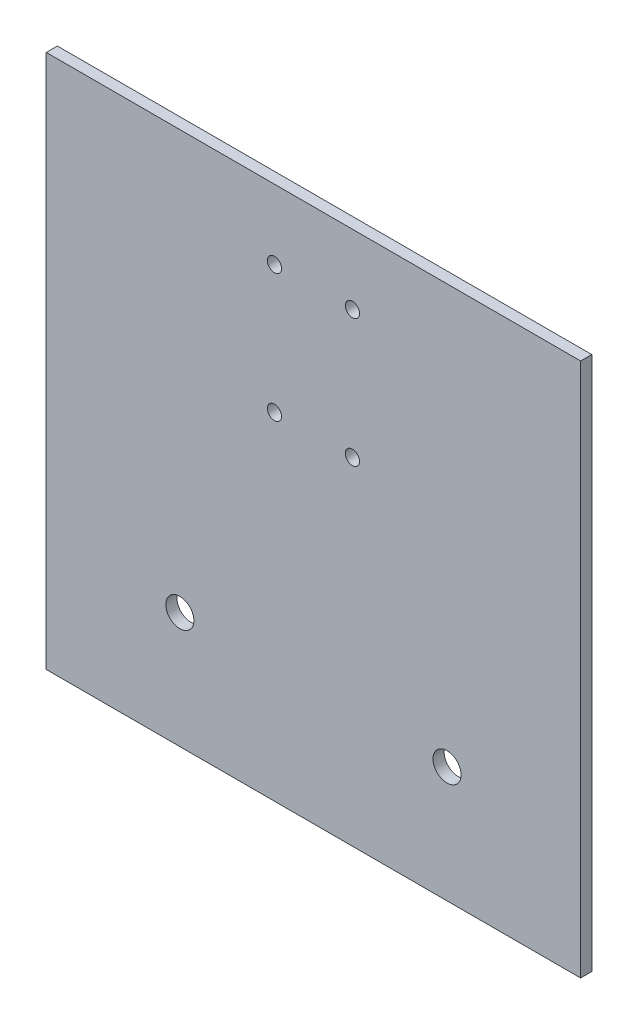
ISO-10303-21;
HEADER;
FILE_DESCRIPTION(('STEP AP214'),'2;1');
FILE_NAME('part.step','',(''),(''),'','','');
FILE_SCHEMA(('AUTOMOTIVE_DESIGN { 1 0 10303 214 1 1 1 1 }'));
ENDSEC;
DATA;
#1=APPLICATION_CONTEXT('core data for automotive mechanical design processes');
#2=APPLICATION_PROTOCOL_DEFINITION('international standard','automotive_design',2000,#1);
#3=PRODUCT_CONTEXT('',#1,'mechanical');
#4=PRODUCT('Part','Part','',(#3));
#5=PRODUCT_RELATED_PRODUCT_CATEGORY('part','',(#4));
#6=PRODUCT_DEFINITION_FORMATION('','',#4);
#7=PRODUCT_DEFINITION_CONTEXT('part definition',#1,'design');
#8=PRODUCT_DEFINITION('design','',#6,#7);
#9=PRODUCT_DEFINITION_SHAPE('','',#8);
#10=(LENGTH_UNIT() NAMED_UNIT(*) SI_UNIT(.MILLI.,.METRE.));
#11=(NAMED_UNIT(*) PLANE_ANGLE_UNIT() SI_UNIT($,.RADIAN.));
#12=(NAMED_UNIT(*) SI_UNIT($,.STERADIAN.) SOLID_ANGLE_UNIT());
#13=UNCERTAINTY_MEASURE_WITH_UNIT(LENGTH_MEASURE(1.E-05),#10,'distance_accuracy_value','');
#14=(GEOMETRIC_REPRESENTATION_CONTEXT(3) GLOBAL_UNCERTAINTY_ASSIGNED_CONTEXT((#13)) GLOBAL_UNIT_ASSIGNED_CONTEXT((#10,
#11,#12)) REPRESENTATION_CONTEXT('',''));
#15=CARTESIAN_POINT('',(0.,0.,0.));
#16=DIRECTION('',(0.,0.,1.));
#17=DIRECTION('',(1.,0.,0.));
#18=AXIS2_PLACEMENT_3D('',#15,#16,#17);
#19=CARTESIAN_POINT('',(-76.2,-76.2,3.175));
#20=DIRECTION('',(1.,0.,0.));
#21=DIRECTION('',(0.,0.,-1.));
#22=AXIS2_PLACEMENT_3D('',#19,#20,#21);
#23=PLANE('',#22);
#24=DIRECTION('',(0.,-1.,0.));
#25=VECTOR('',#24,1.);
#26=CARTESIAN_POINT('',(-76.2,-76.2,0.));
#27=LINE('',#26,#25);
#28=CARTESIAN_POINT('',(-76.2,76.2,0.));
#29=VERTEX_POINT('',#28);
#30=CARTESIAN_POINT('',(-76.2,-76.2,0.));
#31=VERTEX_POINT('',#30);
#32=EDGE_CURVE('E101',#29,#31,#27,.T.);
#33=ORIENTED_EDGE('',*,*,#32,.T.);
#34=DIRECTION('',(0.,0.,-1.));
#35=VECTOR('',#34,1.);
#36=CARTESIAN_POINT('',(-76.2,-76.2,3.175));
#37=LINE('',#36,#35);
#38=CARTESIAN_POINT('',(-76.2,-76.2,3.175));
#39=VERTEX_POINT('',#38);
#40=EDGE_CURVE('E11',#39,#31,#37,.T.);
#41=ORIENTED_EDGE('',*,*,#40,.F.);
#42=DIRECTION('',(0.,-1.,0.));
#43=VECTOR('',#42,1.);
#44=CARTESIAN_POINT('',(-76.2,-76.2,3.175));
#45=LINE('',#44,#43);
#46=CARTESIAN_POINT('',(-76.2,76.2,3.175));
#47=VERTEX_POINT('',#46);
#48=EDGE_CURVE('E88',#47,#39,#45,.T.);
#49=ORIENTED_EDGE('',*,*,#48,.F.);
#50=DIRECTION('',(0.,0.,-1.));
#51=VECTOR('',#50,1.);
#52=CARTESIAN_POINT('',(-76.2,76.2,3.175));
#53=LINE('',#52,#51);
#54=EDGE_CURVE('E97',#47,#29,#53,.T.);
#55=ORIENTED_EDGE('',*,*,#54,.T.);
#56=EDGE_LOOP('',(#33,#41,#49,#55));
#57=FACE_BOUND('',#56,.T.);
#58=ADVANCED_FACE('F35',(#57),#23,.F.);
#59=CARTESIAN_POINT('',(76.2,-76.2,3.175));
#60=DIRECTION('',(0.,1.,0.));
#61=DIRECTION('',(-1.,0.,0.));
#62=AXIS2_PLACEMENT_3D('',#59,#60,#61);
#63=PLANE('',#62);
#64=DIRECTION('',(1.,0.,0.));
#65=VECTOR('',#64,1.);
#66=CARTESIAN_POINT('',(76.2,-76.2,0.));
#67=LINE('',#66,#65);
#68=CARTESIAN_POINT('',(76.2,-76.2,0.));
#69=VERTEX_POINT('',#68);
#70=EDGE_CURVE('E92',#31,#69,#67,.T.);
#71=ORIENTED_EDGE('',*,*,#70,.T.);
#72=DIRECTION('',(0.,0.,-1.));
#73=VECTOR('',#72,1.);
#74=CARTESIAN_POINT('',(76.2,-76.2,3.175));
#75=LINE('',#74,#73);
#76=CARTESIAN_POINT('',(76.2,-76.2,3.175));
#77=VERTEX_POINT('',#76);
#78=EDGE_CURVE('E44',#77,#69,#75,.T.);
#79=ORIENTED_EDGE('',*,*,#78,.F.);
#80=DIRECTION('',(1.,0.,0.));
#81=VECTOR('',#80,1.);
#82=CARTESIAN_POINT('',(76.2,-76.2,3.175));
#83=LINE('',#82,#81);
#84=EDGE_CURVE('E83',#39,#77,#83,.T.);
#85=ORIENTED_EDGE('',*,*,#84,.F.);
#86=ORIENTED_EDGE('',*,*,#40,.T.);
#87=EDGE_LOOP('',(#71,#79,#85,#86));
#88=FACE_BOUND('',#87,.T.);
#89=ADVANCED_FACE('F91',(#88),#63,.F.);
#90=CARTESIAN_POINT('',(76.2,-76.2,3.175));
#91=DIRECTION('',(-1.,0.,0.));
#92=DIRECTION('',(0.,0.,1.));
#93=AXIS2_PLACEMENT_3D('',#90,#91,#92);
#94=PLANE('',#93);
#95=DIRECTION('',(0.,1.,0.));
#96=VECTOR('',#95,1.);
#97=CARTESIAN_POINT('',(76.2,-76.2,0.));
#98=LINE('',#97,#96);
#99=CARTESIAN_POINT('',(76.2,76.2,0.));
#100=VERTEX_POINT('',#99);
#101=EDGE_CURVE('E70',#69,#100,#98,.T.);
#102=ORIENTED_EDGE('',*,*,#101,.T.);
#103=DIRECTION('',(0.,0.,-1.));
#104=VECTOR('',#103,1.);
#105=CARTESIAN_POINT('',(76.2,76.2,3.175));
#106=LINE('',#105,#104);
#107=CARTESIAN_POINT('',(76.2,76.2,3.175));
#108=VERTEX_POINT('',#107);
#109=EDGE_CURVE('E93',#108,#100,#106,.T.);
#110=ORIENTED_EDGE('',*,*,#109,.F.);
#111=DIRECTION('',(0.,1.,0.));
#112=VECTOR('',#111,1.);
#113=CARTESIAN_POINT('',(76.2,-76.2,3.175));
#114=LINE('',#113,#112);
#115=EDGE_CURVE('E86',#77,#108,#114,.T.);
#116=ORIENTED_EDGE('',*,*,#115,.F.);
#117=ORIENTED_EDGE('',*,*,#78,.T.);
#118=EDGE_LOOP('',(#102,#110,#116,#117));
#119=FACE_BOUND('',#118,.T.);
#120=ADVANCED_FACE('F95',(#119),#94,.F.);
#121=CARTESIAN_POINT('',(76.2,76.2,3.175));
#122=DIRECTION('',(0.,-1.,0.));
#123=DIRECTION('',(1.,0.,0.));
#124=AXIS2_PLACEMENT_3D('',#121,#122,#123);
#125=PLANE('',#124);
#126=DIRECTION('',(-1.,0.,0.));
#127=VECTOR('',#126,1.);
#128=CARTESIAN_POINT('',(76.2,76.2,0.));
#129=LINE('',#128,#127);
#130=EDGE_CURVE('E76',#100,#29,#129,.T.);
#131=ORIENTED_EDGE('',*,*,#130,.T.);
#132=ORIENTED_EDGE('',*,*,#54,.F.);
#133=DIRECTION('',(-1.,0.,0.));
#134=VECTOR('',#133,1.);
#135=CARTESIAN_POINT('',(76.2,76.2,3.175));
#136=LINE('',#135,#134);
#137=EDGE_CURVE('E53',#108,#47,#136,.T.);
#138=ORIENTED_EDGE('',*,*,#137,.F.);
#139=ORIENTED_EDGE('',*,*,#109,.T.);
#140=EDGE_LOOP('',(#131,#132,#138,#139));
#141=FACE_BOUND('',#140,.T.);
#142=ADVANCED_FACE('F161',(#141),#125,.F.);
#143=CARTESIAN_POINT('',(0.,0.,3.175));
#144=DIRECTION('',(0.,0.,1.));
#145=DIRECTION('',(1.,0.,0.));
#146=AXIS2_PLACEMENT_3D('',#143,#144,#145);
#147=PLANE('',#146);
#148=CARTESIAN_POINT('',(38.1,-43.0951156812339,3.175));
#149=DIRECTION('',(0.,0.,1.));
#150=DIRECTION('',(1.,0.,0.));
#151=AXIS2_PLACEMENT_3D('',#148,#149,#150);
#152=CIRCLE('',#151,4.00000000000001);
#153=CARTESIAN_POINT('',(42.1,-43.0951156812339,3.175));
#154=VERTEX_POINT('',#153);
#155=EDGE_CURVE('E134',#154,#154,#152,.T.);
#156=ORIENTED_EDGE('',*,*,#155,.F.);
#157=EDGE_LOOP('',(#156));
#158=FACE_BOUND('',#157,.T.);
#159=CARTESIAN_POINT('',(-38.1,-43.0951156812339,3.175));
#160=DIRECTION('',(0.,0.,1.));
#161=DIRECTION('',(1.,0.,0.));
#162=AXIS2_PLACEMENT_3D('',#159,#160,#161);
#163=CIRCLE('',#162,4.00000000000001);
#164=CARTESIAN_POINT('',(-34.1,-43.0951156812339,3.175));
#165=VERTEX_POINT('',#164);
#166=EDGE_CURVE('E126',#165,#165,#163,.T.);
#167=ORIENTED_EDGE('',*,*,#166,.F.);
#168=EDGE_LOOP('',(#167));
#169=FACE_BOUND('',#168,.T.);
#170=CARTESIAN_POINT('',(-11.1125,19.8374,3.175));
#171=DIRECTION('',(0.,0.,1.));
#172=DIRECTION('',(1.,0.,0.));
#173=AXIS2_PLACEMENT_3D('',#170,#171,#172);
#174=CIRCLE('',#173,2.032);
#175=CARTESIAN_POINT('',(-9.08049999999998,19.8374,3.175));
#176=VERTEX_POINT('',#175);
#177=EDGE_CURVE('E121',#176,#176,#174,.F.);
#178=ORIENTED_EDGE('',*,*,#177,.T.);
#179=EDGE_LOOP('',(#178));
#180=FACE_BOUND('',#179,.T.);
#181=CARTESIAN_POINT('',(11.1125,19.8374,3.175));
#182=DIRECTION('',(0.,0.,1.));
#183=DIRECTION('',(1.,0.,0.));
#184=AXIS2_PLACEMENT_3D('',#181,#182,#183);
#185=CIRCLE('',#184,2.032);
#186=CARTESIAN_POINT('',(13.1445,19.8374,3.175));
#187=VERTEX_POINT('',#186);
#188=EDGE_CURVE('E117',#187,#187,#185,.F.);
#189=ORIENTED_EDGE('',*,*,#188,.T.);
#190=EDGE_LOOP('',(#189));
#191=FACE_BOUND('',#190,.T.);
#192=CARTESIAN_POINT('',(11.1125,56.3626,3.175));
#193=DIRECTION('',(0.,0.,1.));
#194=DIRECTION('',(1.,0.,0.));
#195=AXIS2_PLACEMENT_3D('',#192,#193,#194);
#196=CIRCLE('',#195,2.032);
#197=CARTESIAN_POINT('',(13.1445,56.3626,3.175));
#198=VERTEX_POINT('',#197);
#199=EDGE_CURVE('E113',#198,#198,#196,.F.);
#200=ORIENTED_EDGE('',*,*,#199,.T.);
#201=EDGE_LOOP('',(#200));
#202=FACE_BOUND('',#201,.T.);
#203=CARTESIAN_POINT('',(-11.1125,56.3626,3.175));
#204=DIRECTION('',(0.,0.,1.));
#205=DIRECTION('',(1.,0.,0.));
#206=AXIS2_PLACEMENT_3D('',#203,#204,#205);
#207=CIRCLE('',#206,2.032);
#208=CARTESIAN_POINT('',(-9.08049999999998,56.3626,3.175));
#209=VERTEX_POINT('',#208);
#210=EDGE_CURVE('E104',#209,#209,#207,.F.);
#211=ORIENTED_EDGE('',*,*,#210,.T.);
#212=EDGE_LOOP('',(#211));
#213=FACE_BOUND('',#212,.T.);
#214=ORIENTED_EDGE('',*,*,#48,.T.);
#215=ORIENTED_EDGE('',*,*,#84,.T.);
#216=ORIENTED_EDGE('',*,*,#115,.T.);
#217=ORIENTED_EDGE('',*,*,#137,.T.);
#218=EDGE_LOOP('',(#214,#215,#216,#217));
#219=FACE_BOUND('',#218,.T.);
#220=ADVANCED_FACE('F84',(#158,#169,#180,#191,#202,#213,#219),#147,.T.);
#221=CARTESIAN_POINT('',(0.,0.,0.));
#222=DIRECTION('',(0.,0.,1.));
#223=DIRECTION('',(1.,0.,0.));
#224=AXIS2_PLACEMENT_3D('',#221,#222,#223);
#225=PLANE('',#224);
#226=CARTESIAN_POINT('',(38.1,-43.0951156812339,0.));
#227=DIRECTION('',(0.,0.,1.));
#228=DIRECTION('',(1.,0.,0.));
#229=AXIS2_PLACEMENT_3D('',#226,#227,#228);
#230=CIRCLE('',#229,4.00000000000001);
#231=CARTESIAN_POINT('',(42.1,-43.0951156812339,0.));
#232=VERTEX_POINT('',#231);
#233=EDGE_CURVE('E38',#232,#232,#230,.T.);
#234=ORIENTED_EDGE('',*,*,#233,.T.);
#235=EDGE_LOOP('',(#234));
#236=FACE_BOUND('',#235,.T.);
#237=CARTESIAN_POINT('',(-38.1,-43.0951156812339,0.));
#238=DIRECTION('',(0.,0.,1.));
#239=DIRECTION('',(1.,0.,0.));
#240=AXIS2_PLACEMENT_3D('',#237,#238,#239);
#241=CIRCLE('',#240,4.00000000000001);
#242=CARTESIAN_POINT('',(-34.1,-43.0951156812339,0.));
#243=VERTEX_POINT('',#242);
#244=EDGE_CURVE('E124',#243,#243,#241,.T.);
#245=ORIENTED_EDGE('',*,*,#244,.T.);
#246=EDGE_LOOP('',(#245));
#247=FACE_BOUND('',#246,.T.);
#248=CARTESIAN_POINT('',(-11.1125,19.8374,0.));
#249=DIRECTION('',(0.,0.,1.));
#250=DIRECTION('',(1.,0.,0.));
#251=AXIS2_PLACEMENT_3D('',#248,#249,#250);
#252=CIRCLE('',#251,2.032);
#253=CARTESIAN_POINT('',(-9.08049999999998,19.8374,0.));
#254=VERTEX_POINT('',#253);
#255=EDGE_CURVE('E122',#254,#254,#252,.F.);
#256=ORIENTED_EDGE('',*,*,#255,.F.);
#257=EDGE_LOOP('',(#256));
#258=FACE_BOUND('',#257,.T.);
#259=CARTESIAN_POINT('',(11.1125,19.8374,0.));
#260=DIRECTION('',(0.,0.,1.));
#261=DIRECTION('',(1.,0.,0.));
#262=AXIS2_PLACEMENT_3D('',#259,#260,#261);
#263=CIRCLE('',#262,2.032);
#264=CARTESIAN_POINT('',(13.1445,19.8374,0.));
#265=VERTEX_POINT('',#264);
#266=EDGE_CURVE('E118',#265,#265,#263,.F.);
#267=ORIENTED_EDGE('',*,*,#266,.F.);
#268=EDGE_LOOP('',(#267));
#269=FACE_BOUND('',#268,.T.);
#270=CARTESIAN_POINT('',(11.1125,56.3626,0.));
#271=DIRECTION('',(0.,0.,1.));
#272=DIRECTION('',(1.,0.,0.));
#273=AXIS2_PLACEMENT_3D('',#270,#271,#272);
#274=CIRCLE('',#273,2.032);
#275=CARTESIAN_POINT('',(13.1445,56.3626,0.));
#276=VERTEX_POINT('',#275);
#277=EDGE_CURVE('E114',#276,#276,#274,.F.);
#278=ORIENTED_EDGE('',*,*,#277,.F.);
#279=EDGE_LOOP('',(#278));
#280=FACE_BOUND('',#279,.T.);
#281=CARTESIAN_POINT('',(-11.1125,56.3626,0.));
#282=DIRECTION('',(0.,0.,1.));
#283=DIRECTION('',(1.,0.,0.));
#284=AXIS2_PLACEMENT_3D('',#281,#282,#283);
#285=CIRCLE('',#284,2.032);
#286=CARTESIAN_POINT('',(-9.08049999999998,56.3626,0.));
#287=VERTEX_POINT('',#286);
#288=EDGE_CURVE('E110',#287,#287,#285,.F.);
#289=ORIENTED_EDGE('',*,*,#288,.F.);
#290=EDGE_LOOP('',(#289));
#291=FACE_BOUND('',#290,.T.);
#292=ORIENTED_EDGE('',*,*,#32,.F.);
#293=ORIENTED_EDGE('',*,*,#130,.F.);
#294=ORIENTED_EDGE('',*,*,#101,.F.);
#295=ORIENTED_EDGE('',*,*,#70,.F.);
#296=EDGE_LOOP('',(#292,#293,#294,#295));
#297=FACE_BOUND('',#296,.T.);
#298=ADVANCED_FACE('F151',(#236,#247,#258,#269,#280,#291,#297),#225,.F.);
#299=CARTESIAN_POINT('',(-11.1125,56.3626,5.715));
#300=DIRECTION('',(0.,0.,-1.));
#301=DIRECTION('',(-1.,0.,0.));
#302=AXIS2_PLACEMENT_3D('',#299,#300,#301);
#303=CYLINDRICAL_SURFACE('',#302,2.032);
#304=ORIENTED_EDGE('',*,*,#210,.F.);
#305=EDGE_LOOP('',(#304));
#306=FACE_BOUND('',#305,.T.);
#307=ORIENTED_EDGE('',*,*,#288,.T.);
#308=EDGE_LOOP('',(#307));
#309=FACE_BOUND('',#308,.T.);
#310=ADVANCED_FACE('F147',(#306,#309),#303,.F.);
#311=CARTESIAN_POINT('',(11.1125,56.3626,5.715));
#312=DIRECTION('',(0.,0.,-1.));
#313=DIRECTION('',(-1.,0.,0.));
#314=AXIS2_PLACEMENT_3D('',#311,#312,#313);
#315=CYLINDRICAL_SURFACE('',#314,2.032);
#316=ORIENTED_EDGE('',*,*,#199,.F.);
#317=EDGE_LOOP('',(#316));
#318=FACE_BOUND('',#317,.T.);
#319=ORIENTED_EDGE('',*,*,#277,.T.);
#320=EDGE_LOOP('',(#319));
#321=FACE_BOUND('',#320,.T.);
#322=ADVANCED_FACE('F150',(#318,#321),#315,.F.);
#323=CARTESIAN_POINT('',(11.1125,19.8374,5.715));
#324=DIRECTION('',(0.,0.,-1.));
#325=DIRECTION('',(-1.,0.,0.));
#326=AXIS2_PLACEMENT_3D('',#323,#324,#325);
#327=CYLINDRICAL_SURFACE('',#326,2.032);
#328=ORIENTED_EDGE('',*,*,#188,.F.);
#329=EDGE_LOOP('',(#328));
#330=FACE_BOUND('',#329,.T.);
#331=ORIENTED_EDGE('',*,*,#266,.T.);
#332=EDGE_LOOP('',(#331));
#333=FACE_BOUND('',#332,.T.);
#334=ADVANCED_FACE('F204',(#330,#333),#327,.F.);
#335=CARTESIAN_POINT('',(-11.1125,19.8374,5.715));
#336=DIRECTION('',(0.,0.,-1.));
#337=DIRECTION('',(-1.,0.,0.));
#338=AXIS2_PLACEMENT_3D('',#335,#336,#337);
#339=CYLINDRICAL_SURFACE('',#338,2.032);
#340=ORIENTED_EDGE('',*,*,#177,.F.);
#341=EDGE_LOOP('',(#340));
#342=FACE_BOUND('',#341,.T.);
#343=ORIENTED_EDGE('',*,*,#255,.T.);
#344=EDGE_LOOP('',(#343));
#345=FACE_BOUND('',#344,.T.);
#346=ADVANCED_FACE('F214',(#342,#345),#339,.F.);
#347=CARTESIAN_POINT('',(-38.1,-43.0951156812339,-39.243));
#348=DIRECTION('',(0.,0.,1.));
#349=DIRECTION('',(1.,0.,0.));
#350=AXIS2_PLACEMENT_3D('',#347,#348,#349);
#351=CYLINDRICAL_SURFACE('',#350,4.00000000000001);
#352=ORIENTED_EDGE('',*,*,#166,.T.);
#353=EDGE_LOOP('',(#352));
#354=FACE_BOUND('',#353,.T.);
#355=ORIENTED_EDGE('',*,*,#244,.F.);
#356=EDGE_LOOP('',(#355));
#357=FACE_BOUND('',#356,.T.);
#358=ADVANCED_FACE('F223',(#354,#357),#351,.F.);
#359=CARTESIAN_POINT('',(38.1,-43.0951156812339,-39.243));
#360=DIRECTION('',(0.,0.,1.));
#361=DIRECTION('',(1.,0.,0.));
#362=AXIS2_PLACEMENT_3D('',#359,#360,#361);
#363=CYLINDRICAL_SURFACE('',#362,4.00000000000001);
#364=ORIENTED_EDGE('',*,*,#155,.T.);
#365=EDGE_LOOP('',(#364));
#366=FACE_BOUND('',#365,.T.);
#367=ORIENTED_EDGE('',*,*,#233,.F.);
#368=EDGE_LOOP('',(#367));
#369=FACE_BOUND('',#368,.T.);
#370=ADVANCED_FACE('F238',(#366,#369),#363,.F.);
#371=CLOSED_SHELL('',(#58,#89,#120,#142,#220,#298,#310,#322,#334,#346,#358,#370));
#372=MANIFOLD_SOLID_BREP('B2',#371);
#373=ADVANCED_BREP_SHAPE_REPRESENTATION('',(#18,#372),#14);
#374=SHAPE_DEFINITION_REPRESENTATION(#9,#373);
ENDSEC;
END-ISO-10303-21;
